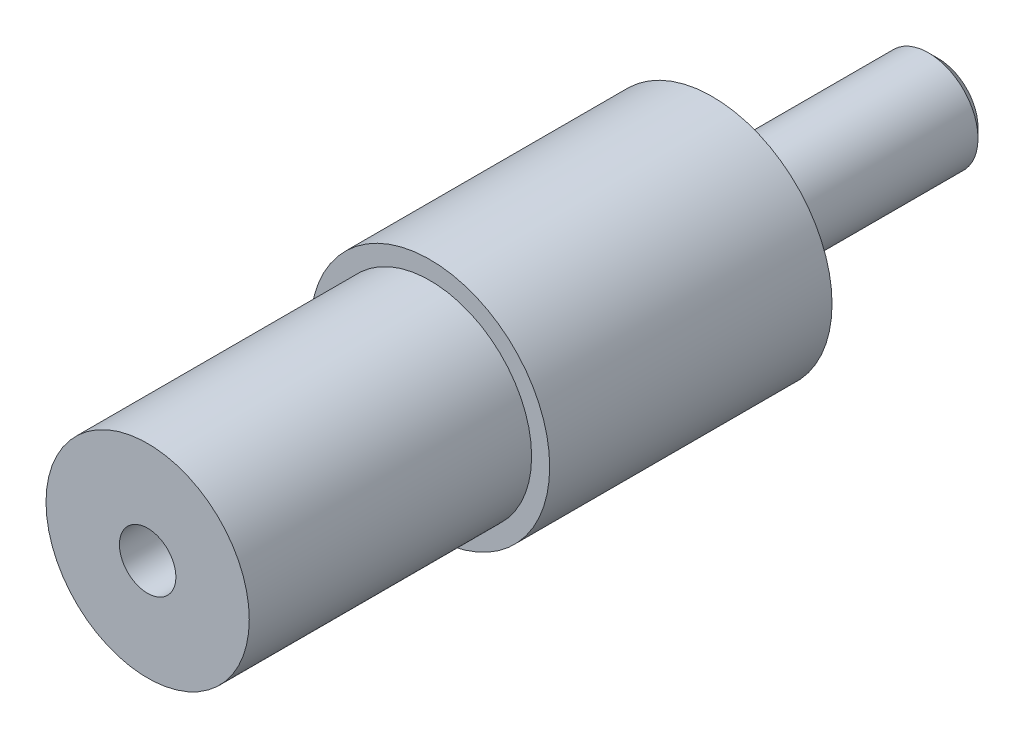
ISO-10303-21;
HEADER;
FILE_DESCRIPTION(('STEP AP214'),'2;1');
FILE_NAME('part.step','',(''),(''),'','','');
FILE_SCHEMA(('AUTOMOTIVE_DESIGN { 1 0 10303 214 1 1 1 1 }'));
ENDSEC;
DATA;
#1=APPLICATION_CONTEXT('core data for automotive mechanical design processes');
#2=APPLICATION_PROTOCOL_DEFINITION('international standard','automotive_design',2000,#1);
#3=PRODUCT_CONTEXT('',#1,'mechanical');
#4=PRODUCT('Part','Part','',(#3));
#5=PRODUCT_RELATED_PRODUCT_CATEGORY('part','',(#4));
#6=PRODUCT_DEFINITION_FORMATION('','',#4);
#7=PRODUCT_DEFINITION_CONTEXT('part definition',#1,'design');
#8=PRODUCT_DEFINITION('design','',#6,#7);
#9=PRODUCT_DEFINITION_SHAPE('','',#8);
#10=(LENGTH_UNIT() NAMED_UNIT(*) SI_UNIT(.MILLI.,.METRE.));
#11=(NAMED_UNIT(*) PLANE_ANGLE_UNIT() SI_UNIT($,.RADIAN.));
#12=(NAMED_UNIT(*) SI_UNIT($,.STERADIAN.) SOLID_ANGLE_UNIT());
#13=UNCERTAINTY_MEASURE_WITH_UNIT(LENGTH_MEASURE(1.E-05),#10,'distance_accuracy_value','');
#14=(GEOMETRIC_REPRESENTATION_CONTEXT(3) GLOBAL_UNCERTAINTY_ASSIGNED_CONTEXT((#13)) GLOBAL_UNIT_ASSIGNED_CONTEXT((#10,
#11,#12)) REPRESENTATION_CONTEXT('',''));
#15=CARTESIAN_POINT('',(0.,0.,0.));
#16=DIRECTION('',(0.,0.,1.));
#17=DIRECTION('',(1.,0.,0.));
#18=AXIS2_PLACEMENT_3D('',#15,#16,#17);
#19=CARTESIAN_POINT('',(0.,0.,31.75));
#20=DIRECTION('',(0.,0.,-1.));
#21=DIRECTION('',(-1.,0.,0.));
#22=AXIS2_PLACEMENT_3D('',#19,#20,#21);
#23=CYLINDRICAL_SURFACE('',#22,13.462);
#24=CARTESIAN_POINT('',(0.,0.,31.75));
#25=DIRECTION('',(0.,0.,1.));
#26=DIRECTION('',(1.,0.,0.));
#27=AXIS2_PLACEMENT_3D('',#24,#25,#26);
#28=CIRCLE('',#27,13.462);
#29=CARTESIAN_POINT('',(13.462,0.,31.75));
#30=VERTEX_POINT('',#29);
#31=EDGE_CURVE('E50',#30,#30,#28,.T.);
#32=ORIENTED_EDGE('',*,*,#31,.F.);
#33=EDGE_LOOP('',(#32));
#34=FACE_BOUND('',#33,.T.);
#35=CARTESIAN_POINT('',(0.,0.,0.));
#36=DIRECTION('',(0.,0.,1.));
#37=DIRECTION('',(1.,0.,0.));
#38=AXIS2_PLACEMENT_3D('',#35,#36,#37);
#39=CIRCLE('',#38,13.462);
#40=CARTESIAN_POINT('',(13.462,0.,0.));
#41=VERTEX_POINT('',#40);
#42=EDGE_CURVE('E46',#41,#41,#39,.T.);
#43=ORIENTED_EDGE('',*,*,#42,.T.);
#44=EDGE_LOOP('',(#43));
#45=FACE_BOUND('',#44,.T.);
#46=ADVANCED_FACE('F43',(#34,#45),#23,.T.);
#47=CARTESIAN_POINT('',(0.,0.,31.75));
#48=DIRECTION('',(0.,0.,1.));
#49=DIRECTION('',(1.,0.,0.));
#50=AXIS2_PLACEMENT_3D('',#47,#48,#49);
#51=PLANE('',#50);
#52=CARTESIAN_POINT('',(0.,0.,31.75));
#53=DIRECTION('',(0.,0.,1.));
#54=DIRECTION('',(1.,0.,0.));
#55=AXIS2_PLACEMENT_3D('',#52,#53,#54);
#56=CIRCLE('',#55,11.43);
#57=CARTESIAN_POINT('',(11.43,0.,31.75));
#58=VERTEX_POINT('',#57);
#59=EDGE_CURVE('E10',#58,#58,#56,.T.);
#60=ORIENTED_EDGE('',*,*,#59,.F.);
#61=EDGE_LOOP('',(#60));
#62=FACE_BOUND('',#61,.T.);
#63=ORIENTED_EDGE('',*,*,#31,.T.);
#64=EDGE_LOOP('',(#63));
#65=FACE_BOUND('',#64,.T.);
#66=ADVANCED_FACE('F90',(#62,#65),#51,.T.);
#67=CARTESIAN_POINT('',(0.,0.,0.));
#68=DIRECTION('',(0.,0.,1.));
#69=DIRECTION('',(1.,0.,0.));
#70=AXIS2_PLACEMENT_3D('',#67,#68,#69);
#71=PLANE('',#70);
#72=CARTESIAN_POINT('',(0.,0.,0.));
#73=DIRECTION('',(0.,0.,1.));
#74=DIRECTION('',(1.,0.,0.));
#75=AXIS2_PLACEMENT_3D('',#72,#73,#74);
#76=CIRCLE('',#75,5.55625);
#77=CARTESIAN_POINT('',(5.55625,0.,0.));
#78=VERTEX_POINT('',#77);
#79=EDGE_CURVE('E71',#78,#78,#76,.T.);
#80=ORIENTED_EDGE('',*,*,#79,.T.);
#81=EDGE_LOOP('',(#80));
#82=FACE_BOUND('',#81,.T.);
#83=ORIENTED_EDGE('',*,*,#42,.F.);
#84=EDGE_LOOP('',(#83));
#85=FACE_BOUND('',#84,.T.);
#86=ADVANCED_FACE('F75',(#82,#85),#71,.F.);
#87=CARTESIAN_POINT('',(0.,0.,63.5));
#88=DIRECTION('',(0.,0.,-1.));
#89=DIRECTION('',(-1.,0.,0.));
#90=AXIS2_PLACEMENT_3D('',#87,#88,#89);
#91=CYLINDRICAL_SURFACE('',#90,11.43);
#92=CARTESIAN_POINT('',(0.,0.,63.5));
#93=DIRECTION('',(0.,0.,1.));
#94=DIRECTION('',(1.,0.,0.));
#95=AXIS2_PLACEMENT_3D('',#92,#93,#94);
#96=CIRCLE('',#95,11.43);
#97=CARTESIAN_POINT('',(11.43,0.,63.5));
#98=VERTEX_POINT('',#97);
#99=EDGE_CURVE('E56',#98,#98,#96,.T.);
#100=ORIENTED_EDGE('',*,*,#99,.F.);
#101=EDGE_LOOP('',(#100));
#102=FACE_BOUND('',#101,.T.);
#103=ORIENTED_EDGE('',*,*,#59,.T.);
#104=EDGE_LOOP('',(#103));
#105=FACE_BOUND('',#104,.T.);
#106=ADVANCED_FACE('F102',(#102,#105),#91,.T.);
#107=CARTESIAN_POINT('',(0.,0.,63.5));
#108=DIRECTION('',(0.,0.,1.));
#109=DIRECTION('',(1.,0.,0.));
#110=AXIS2_PLACEMENT_3D('',#107,#108,#109);
#111=PLANE('',#110);
#112=CARTESIAN_POINT('',(0.,0.,63.5));
#113=DIRECTION('',(0.,0.,1.));
#114=DIRECTION('',(1.,0.,0.));
#115=AXIS2_PLACEMENT_3D('',#112,#113,#114);
#116=CIRCLE('',#115,3.175);
#117=CARTESIAN_POINT('',(3.175,0.,63.5));
#118=VERTEX_POINT('',#117);
#119=EDGE_CURVE('E60',#118,#118,#116,.T.);
#120=ORIENTED_EDGE('',*,*,#119,.F.);
#121=EDGE_LOOP('',(#120));
#122=FACE_BOUND('',#121,.T.);
#123=ORIENTED_EDGE('',*,*,#99,.T.);
#124=EDGE_LOOP('',(#123));
#125=FACE_BOUND('',#124,.T.);
#126=ADVANCED_FACE('F108',(#122,#125),#111,.T.);
#127=CARTESIAN_POINT('',(0.,0.,38.1));
#128=DIRECTION('',(0.,0.,1.));
#129=DIRECTION('',(1.,0.,0.));
#130=AXIS2_PLACEMENT_3D('',#127,#128,#129);
#131=CYLINDRICAL_SURFACE('',#130,3.175);
#132=CARTESIAN_POINT('',(0.,0.,38.1));
#133=DIRECTION('',(0.,0.,1.));
#134=DIRECTION('',(1.,0.,0.));
#135=AXIS2_PLACEMENT_3D('',#132,#133,#134);
#136=CIRCLE('',#135,3.175);
#137=CARTESIAN_POINT('',(3.175,0.,38.1));
#138=VERTEX_POINT('',#137);
#139=EDGE_CURVE('E59',#138,#138,#136,.T.);
#140=ORIENTED_EDGE('',*,*,#139,.F.);
#141=EDGE_LOOP('',(#140));
#142=FACE_BOUND('',#141,.T.);
#143=ORIENTED_EDGE('',*,*,#119,.T.);
#144=EDGE_LOOP('',(#143));
#145=FACE_BOUND('',#144,.T.);
#146=ADVANCED_FACE('F114',(#142,#145),#131,.F.);
#147=CARTESIAN_POINT('',(0.,0.,38.1));
#148=DIRECTION('',(0.,0.,1.));
#149=DIRECTION('',(1.,0.,0.));
#150=AXIS2_PLACEMENT_3D('',#147,#148,#149);
#151=PLANE('',#150);
#152=ORIENTED_EDGE('',*,*,#139,.T.);
#153=EDGE_LOOP('',(#152));
#154=FACE_BOUND('',#153,.T.);
#155=ADVANCED_FACE('F118',(#154),#151,.T.);
#156=CARTESIAN_POINT('',(4.47675,0.,-25.4));
#157=DIRECTION('',(0.,0.,-1.));
#158=DIRECTION('',(-1.,0.,0.));
#159=AXIS2_PLACEMENT_3D('',#156,#157,#158);
#160=PLANE('',#159);
#161=CARTESIAN_POINT('',(0.,0.,-25.4));
#162=DIRECTION('',(0.,0.,1.));
#163=DIRECTION('',(1.,0.,0.));
#164=AXIS2_PLACEMENT_3D('',#161,#162,#163);
#165=CIRCLE('',#164,4.47675);
#166=CARTESIAN_POINT('',(4.47675,0.,-25.4));
#167=VERTEX_POINT('',#166);
#168=EDGE_CURVE('E63',#167,#167,#165,.T.);
#169=ORIENTED_EDGE('',*,*,#168,.F.);
#170=EDGE_LOOP('',(#169));
#171=FACE_BOUND('',#170,.T.);
#172=ADVANCED_FACE('F86',(#171),#160,.T.);
#173=CARTESIAN_POINT('',(0.,0.,-24.3205));
#174=DIRECTION('',(0.,0.,1.));
#175=DIRECTION('',(1.,0.,0.));
#176=AXIS2_PLACEMENT_3D('',#173,#174,#175);
#177=CONICAL_SURFACE('',#176,5.55625,0.785398163397453);
#178=ORIENTED_EDGE('',*,*,#168,.T.);
#179=EDGE_LOOP('',(#178));
#180=FACE_BOUND('',#179,.T.);
#181=CARTESIAN_POINT('',(0.,0.,-24.3205));
#182=DIRECTION('',(0.,0.,1.));
#183=DIRECTION('',(1.,0.,0.));
#184=AXIS2_PLACEMENT_3D('',#181,#182,#183);
#185=CIRCLE('',#184,5.55625);
#186=CARTESIAN_POINT('',(5.55625,0.,-24.3205));
#187=VERTEX_POINT('',#186);
#188=EDGE_CURVE('E68',#187,#187,#185,.T.);
#189=ORIENTED_EDGE('',*,*,#188,.F.);
#190=EDGE_LOOP('',(#189));
#191=FACE_BOUND('',#190,.T.);
#192=ADVANCED_FACE('F80',(#180,#191),#177,.T.);
#193=CARTESIAN_POINT('',(0.,0.,0.));
#194=DIRECTION('',(0.,0.,1.));
#195=DIRECTION('',(1.,0.,0.));
#196=AXIS2_PLACEMENT_3D('',#193,#194,#195);
#197=CYLINDRICAL_SURFACE('',#196,5.55625);
#198=ORIENTED_EDGE('',*,*,#188,.T.);
#199=EDGE_LOOP('',(#198));
#200=FACE_BOUND('',#199,.T.);
#201=ORIENTED_EDGE('',*,*,#79,.F.);
#202=EDGE_LOOP('',(#201));
#203=FACE_BOUND('',#202,.T.);
#204=ADVANCED_FACE('F78',(#200,#203),#197,.T.);
#205=CLOSED_SHELL('',(#46,#66,#86,#106,#126,#146,#155,#172,#192,#204));
#206=MANIFOLD_SOLID_BREP('B2',#205);
#207=ADVANCED_BREP_SHAPE_REPRESENTATION('',(#18,#206),#14);
#208=SHAPE_DEFINITION_REPRESENTATION(#9,#207);
ENDSEC;
END-ISO-10303-21;
